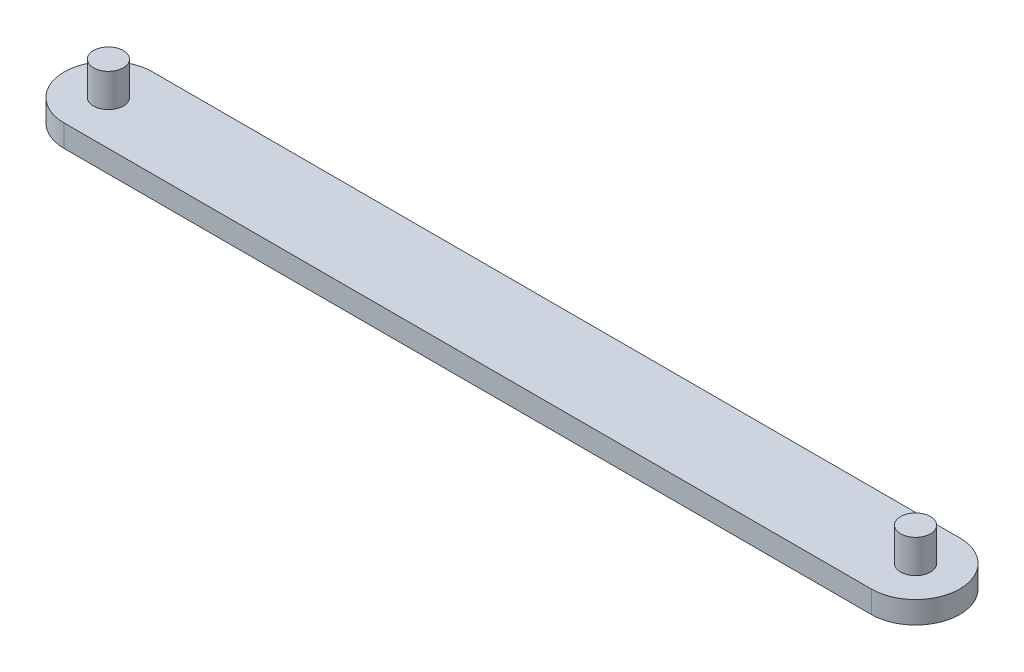
ISO-10303-21;
HEADER;
FILE_DESCRIPTION(('STEP AP214'),'2;1');
FILE_NAME('part.step','',(''),(''),'','','');
FILE_SCHEMA(('AUTOMOTIVE_DESIGN { 1 0 10303 214 1 1 1 1 }'));
ENDSEC;
DATA;
#1=APPLICATION_CONTEXT('core data for automotive mechanical design processes');
#2=APPLICATION_PROTOCOL_DEFINITION('international standard','automotive_design',2000,#1);
#3=PRODUCT_CONTEXT('',#1,'mechanical');
#4=PRODUCT('Part','Part','',(#3));
#5=PRODUCT_RELATED_PRODUCT_CATEGORY('part','',(#4));
#6=PRODUCT_DEFINITION_FORMATION('','',#4);
#7=PRODUCT_DEFINITION_CONTEXT('part definition',#1,'design');
#8=PRODUCT_DEFINITION('design','',#6,#7);
#9=PRODUCT_DEFINITION_SHAPE('','',#8);
#10=(LENGTH_UNIT() NAMED_UNIT(*) SI_UNIT(.MILLI.,.METRE.));
#11=(NAMED_UNIT(*) PLANE_ANGLE_UNIT() SI_UNIT($,.RADIAN.));
#12=(NAMED_UNIT(*) SI_UNIT($,.STERADIAN.) SOLID_ANGLE_UNIT());
#13=UNCERTAINTY_MEASURE_WITH_UNIT(LENGTH_MEASURE(1.E-05),#10,'distance_accuracy_value','');
#14=(GEOMETRIC_REPRESENTATION_CONTEXT(3) GLOBAL_UNCERTAINTY_ASSIGNED_CONTEXT((#13)) GLOBAL_UNIT_ASSIGNED_CONTEXT((#10,
#11,#12)) REPRESENTATION_CONTEXT('',''));
#15=CARTESIAN_POINT('',(0.,0.,0.));
#16=DIRECTION('',(0.,0.,1.));
#17=DIRECTION('',(1.,0.,0.));
#18=AXIS2_PLACEMENT_3D('',#15,#16,#17);
#19=CARTESIAN_POINT('',(36.5,2.,0.));
#20=DIRECTION('',(0.,-1.,0.));
#21=DIRECTION('',(0.,0.,-1.));
#22=AXIS2_PLACEMENT_3D('',#19,#20,#21);
#23=CYLINDRICAL_SURFACE('',#22,4.);
#24=CARTESIAN_POINT('',(36.5,0.,0.));
#25=DIRECTION('',(0.,1.,0.));
#26=DIRECTION('',(0.,0.,1.));
#27=AXIS2_PLACEMENT_3D('',#24,#25,#26);
#28=CIRCLE('',#27,4.);
#29=CARTESIAN_POINT('',(36.5,0.,4.));
#30=VERTEX_POINT('',#29);
#31=CARTESIAN_POINT('',(36.5,0.,-4.));
#32=VERTEX_POINT('',#31);
#33=EDGE_CURVE('E113',#30,#32,#28,.T.);
#34=ORIENTED_EDGE('',*,*,#33,.T.);
#35=DIRECTION('',(0.,-1.,0.));
#36=VECTOR('',#35,1.);
#37=CARTESIAN_POINT('',(36.5,2.,-4.));
#38=LINE('',#37,#36);
#39=CARTESIAN_POINT('',(36.5,2.,-4.));
#40=VERTEX_POINT('',#39);
#41=EDGE_CURVE('E11',#40,#32,#38,.T.);
#42=ORIENTED_EDGE('',*,*,#41,.F.);
#43=CARTESIAN_POINT('',(36.5,2.,0.));
#44=DIRECTION('',(0.,1.,0.));
#45=DIRECTION('',(0.,0.,1.));
#46=AXIS2_PLACEMENT_3D('',#43,#44,#45);
#47=CIRCLE('',#46,4.);
#48=CARTESIAN_POINT('',(36.5,2.,4.));
#49=VERTEX_POINT('',#48);
#50=EDGE_CURVE('E97',#49,#40,#47,.T.);
#51=ORIENTED_EDGE('',*,*,#50,.F.);
#52=DIRECTION('',(0.,-1.,0.));
#53=VECTOR('',#52,1.);
#54=CARTESIAN_POINT('',(36.5,2.,4.));
#55=LINE('',#54,#53);
#56=EDGE_CURVE('E109',#49,#30,#55,.T.);
#57=ORIENTED_EDGE('',*,*,#56,.T.);
#58=EDGE_LOOP('',(#34,#42,#51,#57));
#59=FACE_BOUND('',#58,.T.);
#60=ADVANCED_FACE('F45',(#59),#23,.T.);
#61=CARTESIAN_POINT('',(-36.5,2.,-4.));
#62=DIRECTION('',(0.,0.,1.));
#63=DIRECTION('',(1.,0.,0.));
#64=AXIS2_PLACEMENT_3D('',#61,#62,#63);
#65=PLANE('',#64);
#66=DIRECTION('',(-1.,0.,0.));
#67=VECTOR('',#66,1.);
#68=CARTESIAN_POINT('',(-36.5,0.,-4.));
#69=LINE('',#68,#67);
#70=CARTESIAN_POINT('',(-36.5,0.,-4.));
#71=VERTEX_POINT('',#70);
#72=EDGE_CURVE('E102',#32,#71,#69,.T.);
#73=ORIENTED_EDGE('',*,*,#72,.T.);
#74=DIRECTION('',(0.,-1.,0.));
#75=VECTOR('',#74,1.);
#76=CARTESIAN_POINT('',(-36.5,2.,-4.));
#77=LINE('',#76,#75);
#78=CARTESIAN_POINT('',(-36.5,2.,-4.));
#79=VERTEX_POINT('',#78);
#80=EDGE_CURVE('E54',#79,#71,#77,.T.);
#81=ORIENTED_EDGE('',*,*,#80,.F.);
#82=DIRECTION('',(-1.,0.,0.));
#83=VECTOR('',#82,1.);
#84=CARTESIAN_POINT('',(-36.5,2.,-4.));
#85=LINE('',#84,#83);
#86=EDGE_CURVE('E92',#40,#79,#85,.T.);
#87=ORIENTED_EDGE('',*,*,#86,.F.);
#88=ORIENTED_EDGE('',*,*,#41,.T.);
#89=EDGE_LOOP('',(#73,#81,#87,#88));
#90=FACE_BOUND('',#89,.T.);
#91=ADVANCED_FACE('F101',(#90),#65,.F.);
#92=CARTESIAN_POINT('',(-36.5,2.,0.));
#93=DIRECTION('',(0.,-1.,0.));
#94=DIRECTION('',(0.,0.,-1.));
#95=AXIS2_PLACEMENT_3D('',#92,#93,#94);
#96=CYLINDRICAL_SURFACE('',#95,4.);
#97=CARTESIAN_POINT('',(-36.5,0.,0.));
#98=DIRECTION('',(0.,1.,0.));
#99=DIRECTION('',(0.,0.,-1.));
#100=AXIS2_PLACEMENT_3D('',#97,#98,#99);
#101=CIRCLE('',#100,4.);
#102=CARTESIAN_POINT('',(-36.5,0.,4.));
#103=VERTEX_POINT('',#102);
#104=EDGE_CURVE('E79',#71,#103,#101,.T.);
#105=ORIENTED_EDGE('',*,*,#104,.T.);
#106=DIRECTION('',(0.,-1.,0.));
#107=VECTOR('',#106,1.);
#108=CARTESIAN_POINT('',(-36.5,2.,4.));
#109=LINE('',#108,#107);
#110=CARTESIAN_POINT('',(-36.5,2.,4.));
#111=VERTEX_POINT('',#110);
#112=EDGE_CURVE('E104',#111,#103,#109,.T.);
#113=ORIENTED_EDGE('',*,*,#112,.F.);
#114=CARTESIAN_POINT('',(-36.5,2.,0.));
#115=DIRECTION('',(0.,1.,0.));
#116=DIRECTION('',(0.,0.,-1.));
#117=AXIS2_PLACEMENT_3D('',#114,#115,#116);
#118=CIRCLE('',#117,4.);
#119=EDGE_CURVE('E95',#79,#111,#118,.T.);
#120=ORIENTED_EDGE('',*,*,#119,.F.);
#121=ORIENTED_EDGE('',*,*,#80,.T.);
#122=EDGE_LOOP('',(#105,#113,#120,#121));
#123=FACE_BOUND('',#122,.T.);
#124=ADVANCED_FACE('F105',(#123),#96,.T.);
#125=CARTESIAN_POINT('',(-36.5,2.,4.));
#126=DIRECTION('',(0.,0.,-1.));
#127=DIRECTION('',(-1.,0.,0.));
#128=AXIS2_PLACEMENT_3D('',#125,#126,#127);
#129=PLANE('',#128);
#130=DIRECTION('',(1.,0.,0.));
#131=VECTOR('',#130,1.);
#132=CARTESIAN_POINT('',(-36.5,0.,4.));
#133=LINE('',#132,#131);
#134=EDGE_CURVE('E85',#103,#30,#133,.T.);
#135=ORIENTED_EDGE('',*,*,#134,.T.);
#136=ORIENTED_EDGE('',*,*,#56,.F.);
#137=DIRECTION('',(1.,0.,0.));
#138=VECTOR('',#137,1.);
#139=CARTESIAN_POINT('',(-36.5,2.,4.));
#140=LINE('',#139,#138);
#141=EDGE_CURVE('E62',#111,#49,#140,.T.);
#142=ORIENTED_EDGE('',*,*,#141,.F.);
#143=ORIENTED_EDGE('',*,*,#112,.T.);
#144=EDGE_LOOP('',(#135,#136,#142,#143));
#145=FACE_BOUND('',#144,.T.);
#146=ADVANCED_FACE('F127',(#145),#129,.F.);
#147=CARTESIAN_POINT('',(36.5,2.,0.));
#148=DIRECTION('',(0.,1.,0.));
#149=DIRECTION('',(0.,0.,1.));
#150=AXIS2_PLACEMENT_3D('',#147,#148,#149);
#151=PLANE('',#150);
#152=CARTESIAN_POINT('',(-36.5,2.,0.));
#153=DIRECTION('',(0.,1.,0.));
#154=DIRECTION('',(0.,0.,1.));
#155=AXIS2_PLACEMENT_3D('',#152,#153,#154);
#156=CIRCLE('',#155,1.35);
#157=CARTESIAN_POINT('',(-36.5,2.,1.35));
#158=VERTEX_POINT('',#157);
#159=EDGE_CURVE('E142',#158,#158,#156,.T.);
#160=ORIENTED_EDGE('',*,*,#159,.F.);
#161=EDGE_LOOP('',(#160));
#162=FACE_BOUND('',#161,.T.);
#163=CARTESIAN_POINT('',(36.5,2.,0.));
#164=DIRECTION('',(0.,1.,0.));
#165=DIRECTION('',(0.,0.,-1.));
#166=AXIS2_PLACEMENT_3D('',#163,#164,#165);
#167=CIRCLE('',#166,1.35);
#168=CARTESIAN_POINT('',(36.5,2.,-1.35));
#169=VERTEX_POINT('',#168);
#170=EDGE_CURVE('E138',#169,#169,#167,.T.);
#171=ORIENTED_EDGE('',*,*,#170,.F.);
#172=EDGE_LOOP('',(#171));
#173=FACE_BOUND('',#172,.T.);
#174=ORIENTED_EDGE('',*,*,#50,.T.);
#175=ORIENTED_EDGE('',*,*,#86,.T.);
#176=ORIENTED_EDGE('',*,*,#119,.T.);
#177=ORIENTED_EDGE('',*,*,#141,.T.);
#178=EDGE_LOOP('',(#174,#175,#176,#177));
#179=FACE_BOUND('',#178,.T.);
#180=ADVANCED_FACE('F93',(#162,#173,#179),#151,.T.);
#181=CARTESIAN_POINT('',(36.5,0.,0.));
#182=DIRECTION('',(0.,1.,0.));
#183=DIRECTION('',(0.,0.,1.));
#184=AXIS2_PLACEMENT_3D('',#181,#182,#183);
#185=PLANE('',#184);
#186=ORIENTED_EDGE('',*,*,#33,.F.);
#187=ORIENTED_EDGE('',*,*,#134,.F.);
#188=ORIENTED_EDGE('',*,*,#104,.F.);
#189=ORIENTED_EDGE('',*,*,#72,.F.);
#190=EDGE_LOOP('',(#186,#187,#188,#189));
#191=FACE_BOUND('',#190,.T.);
#192=ADVANCED_FACE('F130',(#191),#185,.F.);
#193=CARTESIAN_POINT('',(36.5,5.,0.));
#194=DIRECTION('',(0.,-1.,0.));
#195=DIRECTION('',(0.,0.,-1.));
#196=AXIS2_PLACEMENT_3D('',#193,#194,#195);
#197=CYLINDRICAL_SURFACE('',#196,1.35);
#198=CARTESIAN_POINT('',(36.5,5.,0.));
#199=DIRECTION('',(0.,1.,0.));
#200=DIRECTION('',(0.,0.,-1.));
#201=AXIS2_PLACEMENT_3D('',#198,#199,#200);
#202=CIRCLE('',#201,1.35);
#203=CARTESIAN_POINT('',(36.5,5.,-1.35));
#204=VERTEX_POINT('',#203);
#205=EDGE_CURVE('E134',#204,#204,#202,.T.);
#206=ORIENTED_EDGE('',*,*,#205,.F.);
#207=EDGE_LOOP('',(#206));
#208=FACE_BOUND('',#207,.T.);
#209=ORIENTED_EDGE('',*,*,#170,.T.);
#210=EDGE_LOOP('',(#209));
#211=FACE_BOUND('',#210,.T.);
#212=ADVANCED_FACE('F164',(#208,#211),#197,.T.);
#213=CARTESIAN_POINT('',(36.5,5.,0.));
#214=DIRECTION('',(0.,-1.,0.));
#215=DIRECTION('',(0.,0.,-1.));
#216=AXIS2_PLACEMENT_3D('',#213,#214,#215);
#217=PLANE('',#216);
#218=ORIENTED_EDGE('',*,*,#205,.T.);
#219=EDGE_LOOP('',(#218));
#220=FACE_BOUND('',#219,.T.);
#221=ADVANCED_FACE('F155',(#220),#217,.F.);
#222=CARTESIAN_POINT('',(-36.5,5.,0.));
#223=DIRECTION('',(0.,-1.,0.));
#224=DIRECTION('',(0.,0.,-1.));
#225=AXIS2_PLACEMENT_3D('',#222,#223,#224);
#226=CYLINDRICAL_SURFACE('',#225,1.35);
#227=CARTESIAN_POINT('',(-36.5,5.,0.));
#228=DIRECTION('',(0.,1.,0.));
#229=DIRECTION('',(0.,0.,1.));
#230=AXIS2_PLACEMENT_3D('',#227,#228,#229);
#231=CIRCLE('',#230,1.35);
#232=CARTESIAN_POINT('',(-36.5,5.,1.35));
#233=VERTEX_POINT('',#232);
#234=EDGE_CURVE('E117',#233,#233,#231,.T.);
#235=ORIENTED_EDGE('',*,*,#234,.F.);
#236=EDGE_LOOP('',(#235));
#237=FACE_BOUND('',#236,.T.);
#238=ORIENTED_EDGE('',*,*,#159,.T.);
#239=EDGE_LOOP('',(#238));
#240=FACE_BOUND('',#239,.T.);
#241=ADVANCED_FACE('F152',(#237,#240),#226,.T.);
#242=CARTESIAN_POINT('',(-36.5,5.,0.));
#243=DIRECTION('',(0.,1.,0.));
#244=DIRECTION('',(0.,0.,1.));
#245=AXIS2_PLACEMENT_3D('',#242,#243,#244);
#246=PLANE('',#245);
#247=ORIENTED_EDGE('',*,*,#234,.T.);
#248=EDGE_LOOP('',(#247));
#249=FACE_BOUND('',#248,.T.);
#250=ADVANCED_FACE('F150',(#249),#246,.T.);
#251=CLOSED_SHELL('',(#60,#91,#124,#146,#180,#192,#212,#221,#241,#250));
#252=MANIFOLD_SOLID_BREP('B2',#251);
#253=ADVANCED_BREP_SHAPE_REPRESENTATION('',(#18,#252),#14);
#254=SHAPE_DEFINITION_REPRESENTATION(#9,#253);
ENDSEC;
END-ISO-10303-21;
